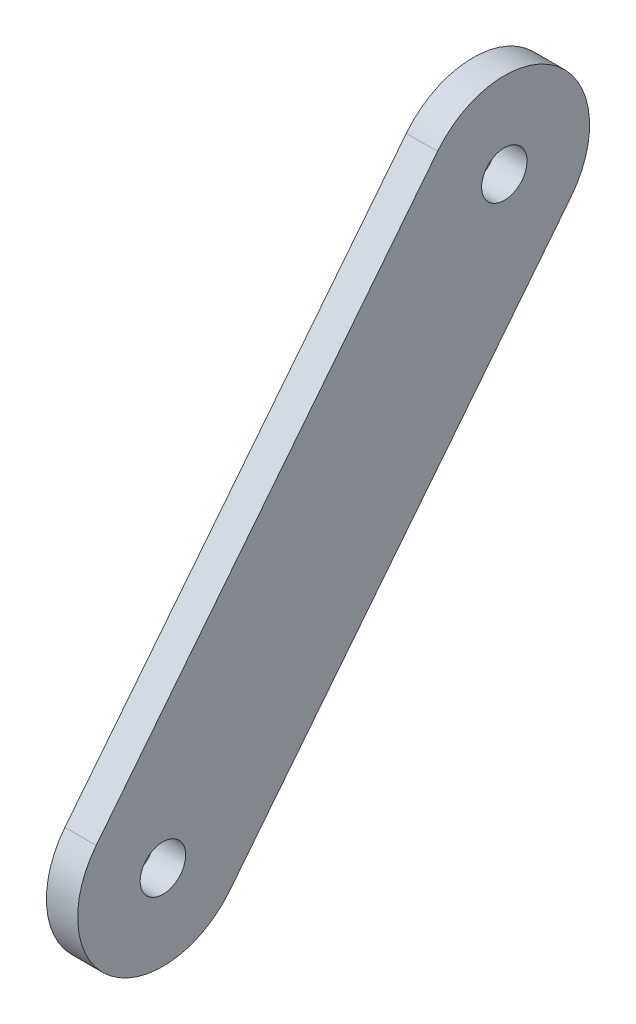
ISO-10303-21;
HEADER;
FILE_DESCRIPTION(('STEP AP214'),'2;1');
FILE_NAME('part.step','',(''),(''),'','','');
FILE_SCHEMA(('AUTOMOTIVE_DESIGN { 1 0 10303 214 1 1 1 1 }'));
ENDSEC;
DATA;
#1=APPLICATION_CONTEXT('core data for automotive mechanical design processes');
#2=APPLICATION_PROTOCOL_DEFINITION('international standard','automotive_design',2000,#1);
#3=PRODUCT_CONTEXT('',#1,'mechanical');
#4=PRODUCT('Part','Part','',(#3));
#5=PRODUCT_RELATED_PRODUCT_CATEGORY('part','',(#4));
#6=PRODUCT_DEFINITION_FORMATION('','',#4);
#7=PRODUCT_DEFINITION_CONTEXT('part definition',#1,'design');
#8=PRODUCT_DEFINITION('design','',#6,#7);
#9=PRODUCT_DEFINITION_SHAPE('','',#8);
#10=(LENGTH_UNIT() NAMED_UNIT(*) SI_UNIT(.MILLI.,.METRE.));
#11=(NAMED_UNIT(*) PLANE_ANGLE_UNIT() SI_UNIT($,.RADIAN.));
#12=(NAMED_UNIT(*) SI_UNIT($,.STERADIAN.) SOLID_ANGLE_UNIT());
#13=UNCERTAINTY_MEASURE_WITH_UNIT(LENGTH_MEASURE(1.E-05),#10,'distance_accuracy_value','');
#14=(GEOMETRIC_REPRESENTATION_CONTEXT(3) GLOBAL_UNCERTAINTY_ASSIGNED_CONTEXT((#13)) GLOBAL_UNIT_ASSIGNED_CONTEXT((#10,
#11,#12)) REPRESENTATION_CONTEXT('',''));
#15=CARTESIAN_POINT('',(0.,0.,0.));
#16=DIRECTION('',(0.,0.,1.));
#17=DIRECTION('',(1.,0.,0.));
#18=AXIS2_PLACEMENT_3D('',#15,#16,#17);
#19=CARTESIAN_POINT('',(5.5,30.6707118445006,-53.1287003542175));
#20=DIRECTION('',(1.,0.,0.));
#21=DIRECTION('',(0.,0.,-1.));
#22=AXIS2_PLACEMENT_3D('',#19,#20,#21);
#23=PLANE('',#22);
#24=CARTESIAN_POINT('',(5.5,106.392676752255,-113.207394430438));
#25=DIRECTION('',(1.,0.,0.));
#26=DIRECTION('',(0.,0.,-1.));
#27=AXIS2_PLACEMENT_3D('',#24,#25,#26);
#28=CIRCLE('',#27,4.00000000073548);
#29=CARTESIAN_POINT('',(5.5,106.392676752255,-117.207394431173));
#30=VERTEX_POINT('',#29);
#31=EDGE_CURVE('E98',#30,#30,#28,.T.);
#32=ORIENTED_EDGE('',*,*,#31,.F.);
#33=EDGE_LOOP('',(#32));
#34=FACE_BOUND('',#33,.T.);
#35=CARTESIAN_POINT('',(5.5,30.6707118445006,-53.1287003542175));
#36=DIRECTION('',(1.,0.,0.));
#37=DIRECTION('',(0.,0.,-1.));
#38=AXIS2_PLACEMENT_3D('',#35,#36,#37);
#39=CIRCLE('',#38,15.);
#40=CARTESIAN_POINT('',(5.5,39.9938559931885,-41.3779989631181));
#41=VERTEX_POINT('',#40);
#42=CARTESIAN_POINT('',(5.5,21.3475676958127,-64.879401745317));
#43=VERTEX_POINT('',#42);
#44=EDGE_CURVE('E83',#41,#43,#39,.T.);
#45=ORIENTED_EDGE('',*,*,#44,.T.);
#46=DIRECTION('',(0.,0.783380092739963,-0.62154294324586));
#47=VECTOR('',#46,1.);
#48=CARTESIAN_POINT('',(5.5,21.3475676958127,-64.879401745317));
#49=LINE('',#48,#47);
#50=CARTESIAN_POINT('',(5.5,97.069532603567,-124.958095821537));
#51=VERTEX_POINT('',#50);
#52=EDGE_CURVE('E78',#43,#51,#49,.T.);
#53=ORIENTED_EDGE('',*,*,#52,.T.);
#54=CARTESIAN_POINT('',(5.5,106.392676752255,-113.207394430438));
#55=DIRECTION('',(1.,0.,0.));
#56=DIRECTION('',(0.,0.,-1.));
#57=AXIS2_PLACEMENT_3D('',#54,#55,#56);
#58=CIRCLE('',#57,15.);
#59=CARTESIAN_POINT('',(5.5,115.715820900943,-101.456693039338));
#60=VERTEX_POINT('',#59);
#61=EDGE_CURVE('E81',#51,#60,#58,.T.);
#62=ORIENTED_EDGE('',*,*,#61,.T.);
#63=DIRECTION('',(0.,-0.783380092739963,0.62154294324586));
#64=VECTOR('',#63,1.);
#65=CARTESIAN_POINT('',(5.5,39.9938559931885,-41.3779989631181));
#66=LINE('',#65,#64);
#67=EDGE_CURVE('E48',#60,#41,#66,.T.);
#68=ORIENTED_EDGE('',*,*,#67,.T.);
#69=EDGE_LOOP('',(#45,#53,#62,#68));
#70=FACE_BOUND('',#69,.T.);
#71=CARTESIAN_POINT('',(5.5,30.6707118445006,-53.1287003542175));
#72=DIRECTION('',(1.,0.,0.));
#73=DIRECTION('',(0.,0.,-1.));
#74=AXIS2_PLACEMENT_3D('',#71,#72,#73);
#75=CIRCLE('',#74,4.00000000051736);
#76=CARTESIAN_POINT('',(5.5,30.6707118445006,-57.1287003547349));
#77=VERTEX_POINT('',#76);
#78=EDGE_CURVE('E113',#77,#77,#75,.T.);
#79=ORIENTED_EDGE('',*,*,#78,.F.);
#80=EDGE_LOOP('',(#79));
#81=FACE_BOUND('',#80,.T.);
#82=ADVANCED_FACE('F31',(#34,#70,#81),#23,.T.);
#83=CARTESIAN_POINT('',(0.,30.6707118445006,-53.1287003542175));
#84=DIRECTION('',(1.,0.,0.));
#85=DIRECTION('',(0.,0.,-1.));
#86=AXIS2_PLACEMENT_3D('',#83,#84,#85);
#87=PLANE('',#86);
#88=CARTESIAN_POINT('',(0.,106.392676752255,-113.207394430438));
#89=DIRECTION('',(1.,0.,0.));
#90=DIRECTION('',(0.,0.,-1.));
#91=AXIS2_PLACEMENT_3D('',#88,#89,#90);
#92=CIRCLE('',#91,4.00000000073548);
#93=CARTESIAN_POINT('',(0.,106.392676752255,-117.207394431173));
#94=VERTEX_POINT('',#93);
#95=EDGE_CURVE('E110',#94,#94,#92,.T.);
#96=ORIENTED_EDGE('',*,*,#95,.T.);
#97=EDGE_LOOP('',(#96));
#98=FACE_BOUND('',#97,.T.);
#99=CARTESIAN_POINT('',(0.,30.6707118445006,-53.1287003542175));
#100=DIRECTION('',(1.,0.,0.));
#101=DIRECTION('',(0.,0.,-1.));
#102=AXIS2_PLACEMENT_3D('',#99,#100,#101);
#103=CIRCLE('',#102,15.);
#104=CARTESIAN_POINT('',(0.,39.9938559931885,-41.3779989631181));
#105=VERTEX_POINT('',#104);
#106=CARTESIAN_POINT('',(0.,21.3475676958127,-64.879401745317));
#107=VERTEX_POINT('',#106);
#108=EDGE_CURVE('E95',#105,#107,#103,.T.);
#109=ORIENTED_EDGE('',*,*,#108,.F.);
#110=DIRECTION('',(0.,-0.783380092739963,0.62154294324586));
#111=VECTOR('',#110,1.);
#112=CARTESIAN_POINT('',(0.,39.9938559931885,-41.3779989631181));
#113=LINE('',#112,#111);
#114=CARTESIAN_POINT('',(0.,115.715820900943,-101.456693039338));
#115=VERTEX_POINT('',#114);
#116=EDGE_CURVE('E71',#115,#105,#113,.T.);
#117=ORIENTED_EDGE('',*,*,#116,.F.);
#118=CARTESIAN_POINT('',(0.,106.392676752255,-113.207394430438));
#119=DIRECTION('',(1.,0.,0.));
#120=DIRECTION('',(0.,0.,-1.));
#121=AXIS2_PLACEMENT_3D('',#118,#119,#120);
#122=CIRCLE('',#121,15.);
#123=CARTESIAN_POINT('',(0.,97.069532603567,-124.958095821537));
#124=VERTEX_POINT('',#123);
#125=EDGE_CURVE('E65',#124,#115,#122,.T.);
#126=ORIENTED_EDGE('',*,*,#125,.F.);
#127=DIRECTION('',(0.,0.783380092739963,-0.62154294324586));
#128=VECTOR('',#127,1.);
#129=CARTESIAN_POINT('',(0.,21.3475676958127,-64.879401745317));
#130=LINE('',#129,#128);
#131=EDGE_CURVE('E87',#107,#124,#130,.T.);
#132=ORIENTED_EDGE('',*,*,#131,.F.);
#133=EDGE_LOOP('',(#109,#117,#126,#132));
#134=FACE_BOUND('',#133,.T.);
#135=CARTESIAN_POINT('',(0.,30.6707118445006,-53.1287003542175));
#136=DIRECTION('',(1.,0.,0.));
#137=DIRECTION('',(0.,0.,-1.));
#138=AXIS2_PLACEMENT_3D('',#135,#136,#137);
#139=CIRCLE('',#138,4.00000000051736);
#140=CARTESIAN_POINT('',(0.,30.6707118445006,-57.1287003547349));
#141=VERTEX_POINT('',#140);
#142=EDGE_CURVE('E116',#141,#141,#139,.T.);
#143=ORIENTED_EDGE('',*,*,#142,.T.);
#144=EDGE_LOOP('',(#143));
#145=FACE_BOUND('',#144,.T.);
#146=ADVANCED_FACE('F106',(#98,#134,#145),#87,.F.);
#147=CARTESIAN_POINT('',(5.5,30.6707118445006,-53.1287003542175));
#148=DIRECTION('',(-1.,0.,0.));
#149=DIRECTION('',(0.,0.,1.));
#150=AXIS2_PLACEMENT_3D('',#147,#148,#149);
#151=CYLINDRICAL_SURFACE('',#150,15.);
#152=ORIENTED_EDGE('',*,*,#108,.T.);
#153=DIRECTION('',(-1.,0.,0.));
#154=VECTOR('',#153,1.);
#155=CARTESIAN_POINT('',(5.5,21.3475676958127,-64.879401745317));
#156=LINE('',#155,#154);
#157=EDGE_CURVE('E11',#43,#107,#156,.T.);
#158=ORIENTED_EDGE('',*,*,#157,.F.);
#159=ORIENTED_EDGE('',*,*,#44,.F.);
#160=DIRECTION('',(-1.,0.,0.));
#161=VECTOR('',#160,1.);
#162=CARTESIAN_POINT('',(5.5,39.9938559931885,-41.3779989631181));
#163=LINE('',#162,#161);
#164=EDGE_CURVE('E91',#41,#105,#163,.T.);
#165=ORIENTED_EDGE('',*,*,#164,.T.);
#166=EDGE_LOOP('',(#152,#158,#159,#165));
#167=FACE_BOUND('',#166,.T.);
#168=ADVANCED_FACE('F33',(#167),#151,.T.);
#169=CARTESIAN_POINT('',(5.5,21.3475676958127,-64.879401745317));
#170=DIRECTION('',(0.,0.62154294324586,0.783380092739963));
#171=DIRECTION('',(0.,-0.783380092739963,0.62154294324586));
#172=AXIS2_PLACEMENT_3D('',#169,#170,#171);
#173=PLANE('',#172);
#174=ORIENTED_EDGE('',*,*,#131,.T.);
#175=DIRECTION('',(-1.,0.,0.));
#176=VECTOR('',#175,1.);
#177=CARTESIAN_POINT('',(5.5,97.069532603567,-124.958095821537));
#178=LINE('',#177,#176);
#179=EDGE_CURVE('E40',#51,#124,#178,.T.);
#180=ORIENTED_EDGE('',*,*,#179,.F.);
#181=ORIENTED_EDGE('',*,*,#52,.F.);
#182=ORIENTED_EDGE('',*,*,#157,.T.);
#183=EDGE_LOOP('',(#174,#180,#181,#182));
#184=FACE_BOUND('',#183,.T.);
#185=ADVANCED_FACE('F86',(#184),#173,.F.);
#186=CARTESIAN_POINT('',(5.5,106.392676752255,-113.207394430438));
#187=DIRECTION('',(-1.,0.,0.));
#188=DIRECTION('',(0.,0.,1.));
#189=AXIS2_PLACEMENT_3D('',#186,#187,#188);
#190=CYLINDRICAL_SURFACE('',#189,15.);
#191=ORIENTED_EDGE('',*,*,#125,.T.);
#192=DIRECTION('',(-1.,0.,0.));
#193=VECTOR('',#192,1.);
#194=CARTESIAN_POINT('',(5.5,115.715820900943,-101.456693039338));
#195=LINE('',#194,#193);
#196=EDGE_CURVE('E88',#60,#115,#195,.T.);
#197=ORIENTED_EDGE('',*,*,#196,.F.);
#198=ORIENTED_EDGE('',*,*,#61,.F.);
#199=ORIENTED_EDGE('',*,*,#179,.T.);
#200=EDGE_LOOP('',(#191,#197,#198,#199));
#201=FACE_BOUND('',#200,.T.);
#202=ADVANCED_FACE('F89',(#201),#190,.T.);
#203=CARTESIAN_POINT('',(5.5,39.9938559931885,-41.3779989631181));
#204=DIRECTION('',(0.,-0.62154294324586,-0.783380092739963));
#205=DIRECTION('',(0.,0.783380092739963,-0.62154294324586));
#206=AXIS2_PLACEMENT_3D('',#203,#204,#205);
#207=PLANE('',#206);
#208=ORIENTED_EDGE('',*,*,#116,.T.);
#209=ORIENTED_EDGE('',*,*,#164,.F.);
#210=ORIENTED_EDGE('',*,*,#67,.F.);
#211=ORIENTED_EDGE('',*,*,#196,.T.);
#212=EDGE_LOOP('',(#208,#209,#210,#211));
#213=FACE_BOUND('',#212,.T.);
#214=ADVANCED_FACE('F103',(#213),#207,.F.);
#215=CARTESIAN_POINT('',(5.5,106.392676752255,-113.207394430438));
#216=DIRECTION('',(-1.,0.,0.));
#217=DIRECTION('',(0.,0.,1.));
#218=AXIS2_PLACEMENT_3D('',#215,#216,#217);
#219=CYLINDRICAL_SURFACE('',#218,4.00000000073548);
#220=ORIENTED_EDGE('',*,*,#31,.T.);
#221=EDGE_LOOP('',(#220));
#222=FACE_BOUND('',#221,.T.);
#223=ORIENTED_EDGE('',*,*,#95,.F.);
#224=EDGE_LOOP('',(#223));
#225=FACE_BOUND('',#224,.T.);
#226=ADVANCED_FACE('F134',(#222,#225),#219,.F.);
#227=CARTESIAN_POINT('',(5.5,30.6707118445006,-53.1287003542175));
#228=DIRECTION('',(-1.,0.,0.));
#229=DIRECTION('',(0.,0.,1.));
#230=AXIS2_PLACEMENT_3D('',#227,#228,#229);
#231=CYLINDRICAL_SURFACE('',#230,4.00000000051736);
#232=ORIENTED_EDGE('',*,*,#78,.T.);
#233=EDGE_LOOP('',(#232));
#234=FACE_BOUND('',#233,.T.);
#235=ORIENTED_EDGE('',*,*,#142,.F.);
#236=EDGE_LOOP('',(#235));
#237=FACE_BOUND('',#236,.T.);
#238=ADVANCED_FACE('F122',(#234,#237),#231,.F.);
#239=CLOSED_SHELL('',(#82,#146,#168,#185,#202,#214,#226,#238));
#240=MANIFOLD_SOLID_BREP('B2',#239);
#241=ADVANCED_BREP_SHAPE_REPRESENTATION('',(#18,#240),#14);
#242=SHAPE_DEFINITION_REPRESENTATION(#9,#241);
ENDSEC;
END-ISO-10303-21;
